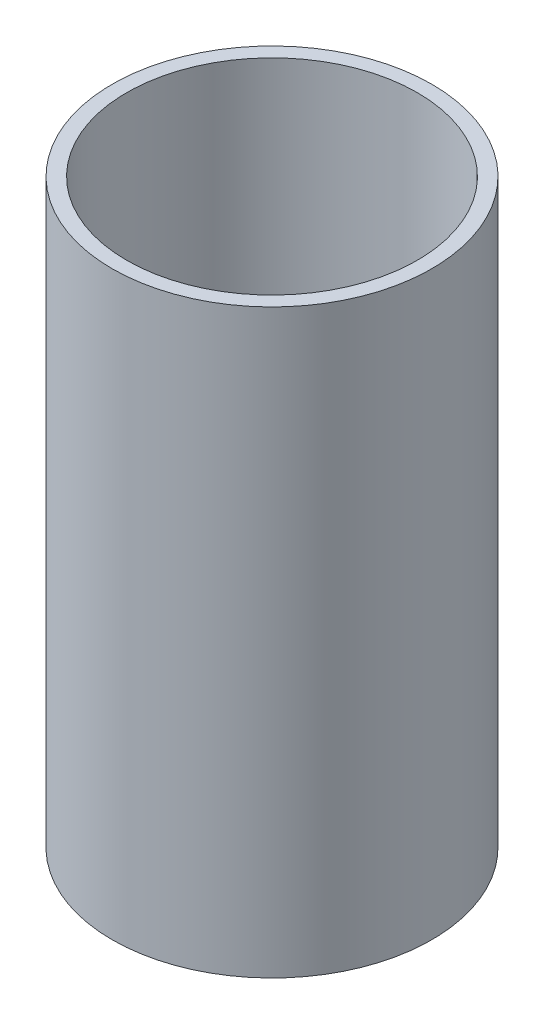
ISO-10303-21;
HEADER;
FILE_DESCRIPTION(('STEP AP214'),'2;1');
FILE_NAME('part.step','',(''),(''),'','','');
FILE_SCHEMA(('AUTOMOTIVE_DESIGN { 1 0 10303 214 1 1 1 1 }'));
ENDSEC;
DATA;
#1=APPLICATION_CONTEXT('core data for automotive mechanical design processes');
#2=APPLICATION_PROTOCOL_DEFINITION('international standard','automotive_design',2000,#1);
#3=PRODUCT_CONTEXT('',#1,'mechanical');
#4=PRODUCT('Part','Part','',(#3));
#5=PRODUCT_RELATED_PRODUCT_CATEGORY('part','',(#4));
#6=PRODUCT_DEFINITION_FORMATION('','',#4);
#7=PRODUCT_DEFINITION_CONTEXT('part definition',#1,'design');
#8=PRODUCT_DEFINITION('design','',#6,#7);
#9=PRODUCT_DEFINITION_SHAPE('','',#8);
#10=(LENGTH_UNIT() NAMED_UNIT(*) SI_UNIT(.MILLI.,.METRE.));
#11=(NAMED_UNIT(*) PLANE_ANGLE_UNIT() SI_UNIT($,.RADIAN.));
#12=(NAMED_UNIT(*) SI_UNIT($,.STERADIAN.) SOLID_ANGLE_UNIT());
#13=UNCERTAINTY_MEASURE_WITH_UNIT(LENGTH_MEASURE(1.E-05),#10,'distance_accuracy_value','');
#14=(GEOMETRIC_REPRESENTATION_CONTEXT(3) GLOBAL_UNCERTAINTY_ASSIGNED_CONTEXT((#13)) GLOBAL_UNIT_ASSIGNED_CONTEXT((#10,
#11,#12)) REPRESENTATION_CONTEXT('',''));
#15=CARTESIAN_POINT('',(0.,0.,0.));
#16=DIRECTION('',(0.,0.,1.));
#17=DIRECTION('',(1.,0.,0.));
#18=AXIS2_PLACEMENT_3D('',#15,#16,#17);
#19=CARTESIAN_POINT('',(0.,101.6,0.));
#20=DIRECTION('',(0.,1.,0.));
#21=DIRECTION('',(0.,0.,1.));
#22=AXIS2_PLACEMENT_3D('',#19,#20,#21);
#23=PLANE('',#22);
#24=CARTESIAN_POINT('',(0.,101.6,0.));
#25=DIRECTION('',(0.,1.,0.));
#26=DIRECTION('',(0.,0.,1.));
#27=AXIS2_PLACEMENT_3D('',#24,#25,#26);
#28=CIRCLE('',#27,27.94);
#29=CARTESIAN_POINT('',(0.,101.6,27.94));
#30=VERTEX_POINT('',#29);
#31=EDGE_CURVE('E10',#30,#30,#28,.T.);
#32=ORIENTED_EDGE('',*,*,#31,.T.);
#33=EDGE_LOOP('',(#32));
#34=FACE_BOUND('',#33,.T.);
#35=CARTESIAN_POINT('',(0.,101.6,0.));
#36=DIRECTION('',(0.,1.,0.));
#37=DIRECTION('',(0.,0.,1.));
#38=AXIS2_PLACEMENT_3D('',#35,#36,#37);
#39=CIRCLE('',#38,25.4);
#40=CARTESIAN_POINT('',(0.,101.6,25.4));
#41=VERTEX_POINT('',#40);
#42=EDGE_CURVE('E39',#41,#41,#39,.T.);
#43=ORIENTED_EDGE('',*,*,#42,.F.);
#44=EDGE_LOOP('',(#43));
#45=FACE_BOUND('',#44,.T.);
#46=ADVANCED_FACE('F28',(#34,#45),#23,.T.);
#47=CARTESIAN_POINT('',(0.,0.,0.));
#48=DIRECTION('',(0.,1.,0.));
#49=DIRECTION('',(0.,0.,1.));
#50=AXIS2_PLACEMENT_3D('',#47,#48,#49);
#51=PLANE('',#50);
#52=CARTESIAN_POINT('',(0.,0.,0.));
#53=DIRECTION('',(0.,1.,0.));
#54=DIRECTION('',(0.,0.,1.));
#55=AXIS2_PLACEMENT_3D('',#52,#53,#54);
#56=CIRCLE('',#55,27.94);
#57=CARTESIAN_POINT('',(0.,0.,27.94));
#58=VERTEX_POINT('',#57);
#59=EDGE_CURVE('E32',#58,#58,#56,.T.);
#60=ORIENTED_EDGE('',*,*,#59,.F.);
#61=EDGE_LOOP('',(#60));
#62=FACE_BOUND('',#61,.T.);
#63=CARTESIAN_POINT('',(0.,0.,0.));
#64=DIRECTION('',(0.,1.,0.));
#65=DIRECTION('',(0.,0.,1.));
#66=AXIS2_PLACEMENT_3D('',#63,#64,#65);
#67=CIRCLE('',#66,25.4);
#68=CARTESIAN_POINT('',(0.,0.,25.4));
#69=VERTEX_POINT('',#68);
#70=EDGE_CURVE('E41',#69,#69,#67,.T.);
#71=ORIENTED_EDGE('',*,*,#70,.T.);
#72=EDGE_LOOP('',(#71));
#73=FACE_BOUND('',#72,.T.);
#74=ADVANCED_FACE('F51',(#62,#73),#51,.F.);
#75=CARTESIAN_POINT('',(0.,101.6,0.));
#76=DIRECTION('',(0.,-1.,0.));
#77=DIRECTION('',(0.,0.,-1.));
#78=AXIS2_PLACEMENT_3D('',#75,#76,#77);
#79=CYLINDRICAL_SURFACE('',#78,27.94);
#80=ORIENTED_EDGE('',*,*,#31,.F.);
#81=EDGE_LOOP('',(#80));
#82=FACE_BOUND('',#81,.T.);
#83=ORIENTED_EDGE('',*,*,#59,.T.);
#84=EDGE_LOOP('',(#83));
#85=FACE_BOUND('',#84,.T.);
#86=ADVANCED_FACE('F30',(#82,#85),#79,.T.);
#87=CARTESIAN_POINT('',(0.,101.6,0.));
#88=DIRECTION('',(0.,-1.,0.));
#89=DIRECTION('',(0.,0.,-1.));
#90=AXIS2_PLACEMENT_3D('',#87,#88,#89);
#91=CYLINDRICAL_SURFACE('',#90,25.4);
#92=ORIENTED_EDGE('',*,*,#42,.T.);
#93=EDGE_LOOP('',(#92));
#94=FACE_BOUND('',#93,.T.);
#95=ORIENTED_EDGE('',*,*,#70,.F.);
#96=EDGE_LOOP('',(#95));
#97=FACE_BOUND('',#96,.T.);
#98=ADVANCED_FACE('F47',(#94,#97),#91,.F.);
#99=CLOSED_SHELL('',(#46,#74,#86,#98));
#100=MANIFOLD_SOLID_BREP('B2',#99);
#101=ADVANCED_BREP_SHAPE_REPRESENTATION('',(#18,#100),#14);
#102=SHAPE_DEFINITION_REPRESENTATION(#9,#101);
ENDSEC;
END-ISO-10303-21;
